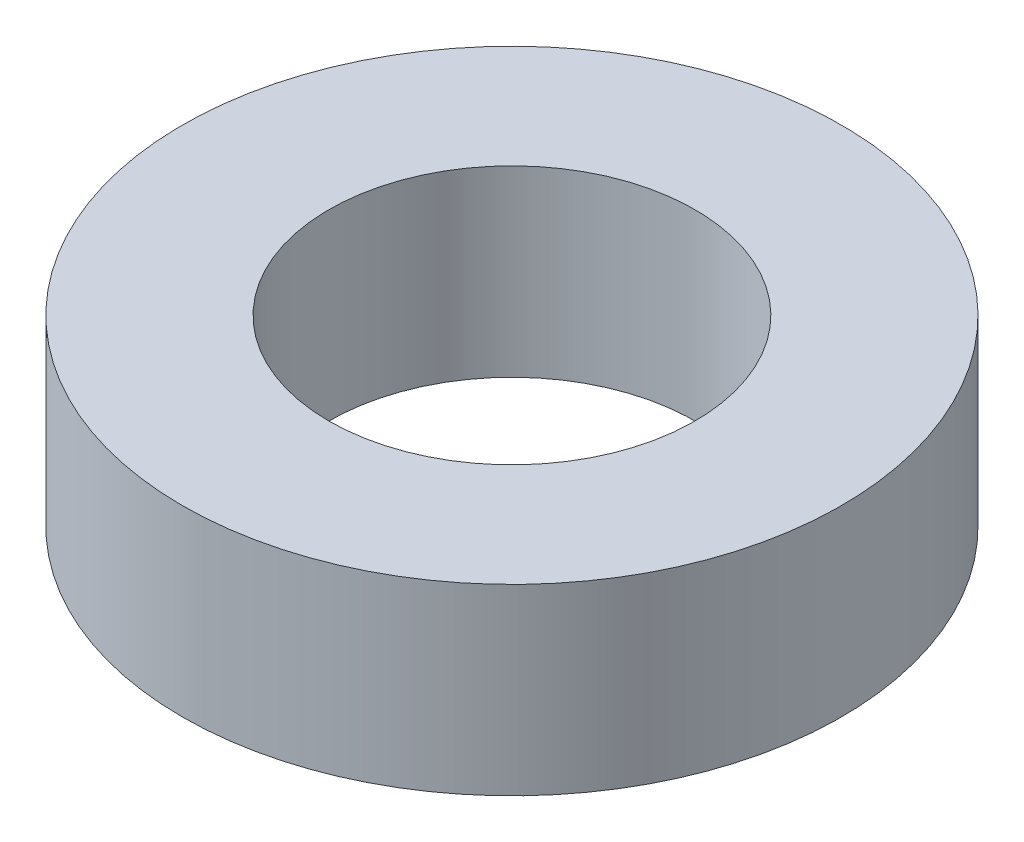
ISO-10303-21;
HEADER;
FILE_DESCRIPTION(('STEP AP214'),'2;1');
FILE_NAME('part.step','',(''),(''),'','','');
FILE_SCHEMA(('AUTOMOTIVE_DESIGN { 1 0 10303 214 1 1 1 1 }'));
ENDSEC;
DATA;
#1=APPLICATION_CONTEXT('core data for automotive mechanical design processes');
#2=APPLICATION_PROTOCOL_DEFINITION('international standard','automotive_design',2000,#1);
#3=PRODUCT_CONTEXT('',#1,'mechanical');
#4=PRODUCT('Part','Part','',(#3));
#5=PRODUCT_RELATED_PRODUCT_CATEGORY('part','',(#4));
#6=PRODUCT_DEFINITION_FORMATION('','',#4);
#7=PRODUCT_DEFINITION_CONTEXT('part definition',#1,'design');
#8=PRODUCT_DEFINITION('design','',#6,#7);
#9=PRODUCT_DEFINITION_SHAPE('','',#8);
#10=(LENGTH_UNIT() NAMED_UNIT(*) SI_UNIT(.MILLI.,.METRE.));
#11=(NAMED_UNIT(*) PLANE_ANGLE_UNIT() SI_UNIT($,.RADIAN.));
#12=(NAMED_UNIT(*) SI_UNIT($,.STERADIAN.) SOLID_ANGLE_UNIT());
#13=UNCERTAINTY_MEASURE_WITH_UNIT(LENGTH_MEASURE(1.E-05),#10,'distance_accuracy_value','');
#14=(GEOMETRIC_REPRESENTATION_CONTEXT(3) GLOBAL_UNCERTAINTY_ASSIGNED_CONTEXT((#13)) GLOBAL_UNIT_ASSIGNED_CONTEXT((#10,
#11,#12)) REPRESENTATION_CONTEXT('',''));
#15=CARTESIAN_POINT('',(0.,0.,0.));
#16=DIRECTION('',(0.,0.,1.));
#17=DIRECTION('',(1.,0.,0.));
#18=AXIS2_PLACEMENT_3D('',#15,#16,#17);
#19=CARTESIAN_POINT('',(0.,2.5,0.));
#20=DIRECTION('',(0.,1.,0.));
#21=DIRECTION('',(0.,0.,1.));
#22=AXIS2_PLACEMENT_3D('',#19,#20,#21);
#23=PLANE('',#22);
#24=CARTESIAN_POINT('',(0.,2.5,0.));
#25=DIRECTION('',(0.,1.,0.));
#26=DIRECTION('',(0.,0.,1.));
#27=AXIS2_PLACEMENT_3D('',#24,#25,#26);
#28=CIRCLE('',#27,4.5);
#29=CARTESIAN_POINT('',(0.,2.5,4.5));
#30=VERTEX_POINT('',#29);
#31=EDGE_CURVE('E10',#30,#30,#28,.T.);
#32=ORIENTED_EDGE('',*,*,#31,.T.);
#33=EDGE_LOOP('',(#32));
#34=FACE_BOUND('',#33,.T.);
#35=CARTESIAN_POINT('',(0.,2.5,0.));
#36=DIRECTION('',(0.,1.,0.));
#37=DIRECTION('',(0.,0.,1.));
#38=AXIS2_PLACEMENT_3D('',#35,#36,#37);
#39=CIRCLE('',#38,2.5);
#40=CARTESIAN_POINT('',(0.,2.5,2.5));
#41=VERTEX_POINT('',#40);
#42=EDGE_CURVE('E42',#41,#41,#39,.T.);
#43=ORIENTED_EDGE('',*,*,#42,.F.);
#44=EDGE_LOOP('',(#43));
#45=FACE_BOUND('',#44,.T.);
#46=ADVANCED_FACE('F31',(#34,#45),#23,.T.);
#47=CARTESIAN_POINT('',(0.,0.,0.));
#48=DIRECTION('',(0.,1.,0.));
#49=DIRECTION('',(0.,0.,1.));
#50=AXIS2_PLACEMENT_3D('',#47,#48,#49);
#51=PLANE('',#50);
#52=CARTESIAN_POINT('',(0.,0.,0.));
#53=DIRECTION('',(0.,1.,0.));
#54=DIRECTION('',(0.,0.,1.));
#55=AXIS2_PLACEMENT_3D('',#52,#53,#54);
#56=CIRCLE('',#55,4.5);
#57=CARTESIAN_POINT('',(0.,0.,4.5));
#58=VERTEX_POINT('',#57);
#59=EDGE_CURVE('E35',#58,#58,#56,.T.);
#60=ORIENTED_EDGE('',*,*,#59,.F.);
#61=EDGE_LOOP('',(#60));
#62=FACE_BOUND('',#61,.T.);
#63=CARTESIAN_POINT('',(0.,0.,0.));
#64=DIRECTION('',(0.,1.,0.));
#65=DIRECTION('',(0.,0.,1.));
#66=AXIS2_PLACEMENT_3D('',#63,#64,#65);
#67=CIRCLE('',#66,2.5);
#68=CARTESIAN_POINT('',(0.,0.,2.5));
#69=VERTEX_POINT('',#68);
#70=EDGE_CURVE('E44',#69,#69,#67,.T.);
#71=ORIENTED_EDGE('',*,*,#70,.T.);
#72=EDGE_LOOP('',(#71));
#73=FACE_BOUND('',#72,.T.);
#74=ADVANCED_FACE('F54',(#62,#73),#51,.F.);
#75=CARTESIAN_POINT('',(0.,2.5,0.));
#76=DIRECTION('',(0.,-1.,0.));
#77=DIRECTION('',(0.,0.,-1.));
#78=AXIS2_PLACEMENT_3D('',#75,#76,#77);
#79=CYLINDRICAL_SURFACE('',#78,4.5);
#80=ORIENTED_EDGE('',*,*,#31,.F.);
#81=EDGE_LOOP('',(#80));
#82=FACE_BOUND('',#81,.T.);
#83=ORIENTED_EDGE('',*,*,#59,.T.);
#84=EDGE_LOOP('',(#83));
#85=FACE_BOUND('',#84,.T.);
#86=ADVANCED_FACE('F33',(#82,#85),#79,.T.);
#87=CARTESIAN_POINT('',(0.,2.5,0.));
#88=DIRECTION('',(0.,-1.,0.));
#89=DIRECTION('',(0.,0.,-1.));
#90=AXIS2_PLACEMENT_3D('',#87,#88,#89);
#91=CYLINDRICAL_SURFACE('',#90,2.5);
#92=ORIENTED_EDGE('',*,*,#42,.T.);
#93=EDGE_LOOP('',(#92));
#94=FACE_BOUND('',#93,.T.);
#95=ORIENTED_EDGE('',*,*,#70,.F.);
#96=EDGE_LOOP('',(#95));
#97=FACE_BOUND('',#96,.T.);
#98=ADVANCED_FACE('F50',(#94,#97),#91,.F.);
#99=CLOSED_SHELL('',(#46,#74,#86,#98));
#100=MANIFOLD_SOLID_BREP('B2',#99);
#101=ADVANCED_BREP_SHAPE_REPRESENTATION('',(#18,#100),#14);
#102=SHAPE_DEFINITION_REPRESENTATION(#9,#101);
ENDSEC;
END-ISO-10303-21;
